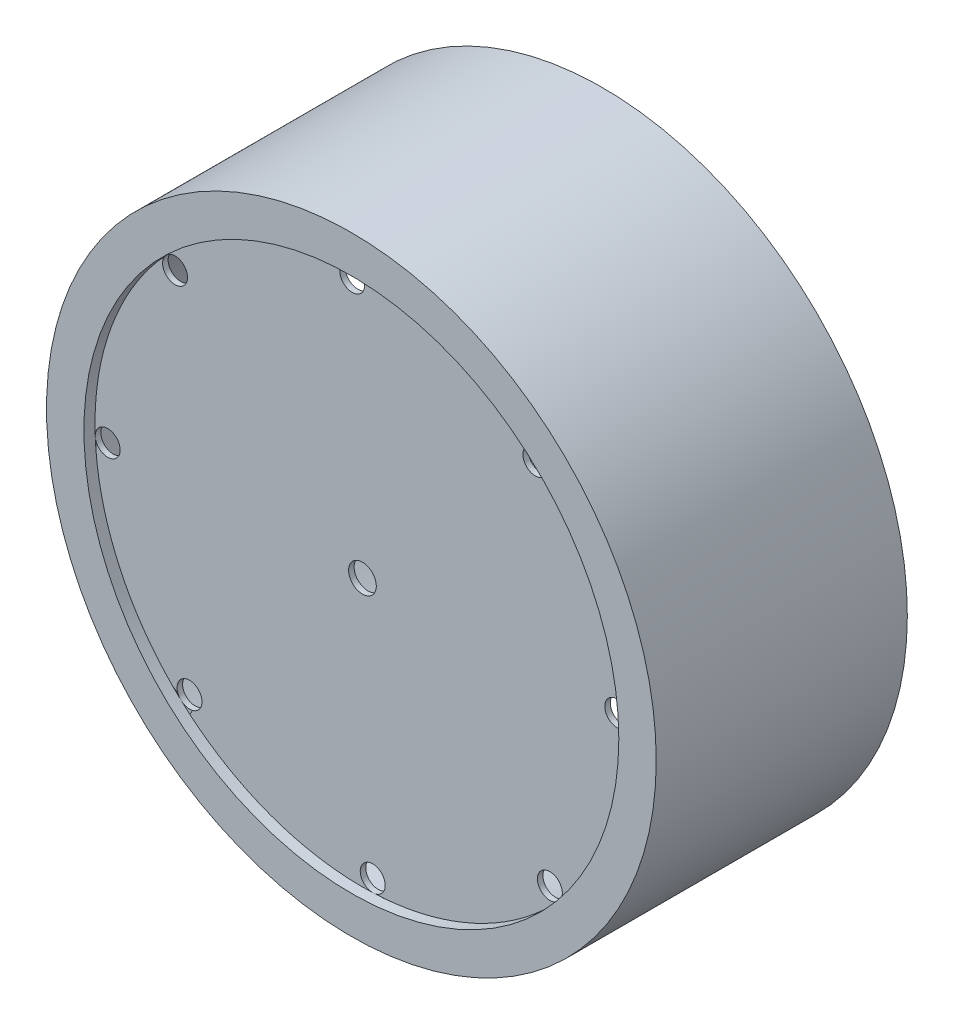
ISO-10303-21;
HEADER;
FILE_DESCRIPTION(('STEP AP214'),'2;1');
FILE_NAME('part.step','',(''),(''),'','','');
FILE_SCHEMA(('AUTOMOTIVE_DESIGN { 1 0 10303 214 1 1 1 1 }'));
ENDSEC;
DATA;
#1=APPLICATION_CONTEXT('core data for automotive mechanical design processes');
#2=APPLICATION_PROTOCOL_DEFINITION('international standard','automotive_design',2000,#1);
#3=PRODUCT_CONTEXT('',#1,'mechanical');
#4=PRODUCT('Part','Part','',(#3));
#5=PRODUCT_RELATED_PRODUCT_CATEGORY('part','',(#4));
#6=PRODUCT_DEFINITION_FORMATION('','',#4);
#7=PRODUCT_DEFINITION_CONTEXT('part definition',#1,'design');
#8=PRODUCT_DEFINITION('design','',#6,#7);
#9=PRODUCT_DEFINITION_SHAPE('','',#8);
#10=(LENGTH_UNIT() NAMED_UNIT(*) SI_UNIT(.MILLI.,.METRE.));
#11=(NAMED_UNIT(*) PLANE_ANGLE_UNIT() SI_UNIT($,.RADIAN.));
#12=(NAMED_UNIT(*) SI_UNIT($,.STERADIAN.) SOLID_ANGLE_UNIT());
#13=UNCERTAINTY_MEASURE_WITH_UNIT(LENGTH_MEASURE(1.E-05),#10,'distance_accuracy_value','');
#14=(GEOMETRIC_REPRESENTATION_CONTEXT(3) GLOBAL_UNCERTAINTY_ASSIGNED_CONTEXT((#13)) GLOBAL_UNIT_ASSIGNED_CONTEXT((#10,
#11,#12)) REPRESENTATION_CONTEXT('',''));
#15=CARTESIAN_POINT('',(0.,0.,0.));
#16=DIRECTION('',(0.,0.,1.));
#17=DIRECTION('',(1.,0.,0.));
#18=AXIS2_PLACEMENT_3D('',#15,#16,#17);
#19=CARTESIAN_POINT('',(0.,0.,45.3));
#20=DIRECTION('',(0.,0.,-1.));
#21=DIRECTION('',(-1.,0.,0.));
#22=AXIS2_PLACEMENT_3D('',#19,#20,#21);
#23=CYLINDRICAL_SURFACE('',#22,55.);
#24=CARTESIAN_POINT('',(0.,0.,0.));
#25=DIRECTION('',(0.,0.,1.));
#26=DIRECTION('',(1.,0.,0.));
#27=AXIS2_PLACEMENT_3D('',#24,#25,#26);
#28=CIRCLE('',#27,55.);
#29=CARTESIAN_POINT('',(-52.9150262213755,-14.9999999997046,0.));
#30=VERTEX_POINT('',#29);
#31=CARTESIAN_POINT('',(-51.2347538298004,-19.9999999999939,0.));
#32=VERTEX_POINT('',#31);
#33=EDGE_CURVE('E239',#30,#32,#28,.T.);
#34=ORIENTED_EDGE('',*,*,#33,.T.);
#35=DIRECTION('',(0.,0.,-1.));
#36=VECTOR('',#35,1.);
#37=CARTESIAN_POINT('',(-51.2347538298004,-19.9999999999939,45.3));
#38=LINE('',#37,#36);
#39=CARTESIAN_POINT('',(-51.2347538298004,-19.9999999999939,15.));
#40=VERTEX_POINT('',#39);
#41=EDGE_CURVE('E58',#32,#40,#38,.F.);
#42=ORIENTED_EDGE('',*,*,#41,.T.);
#43=CARTESIAN_POINT('',(0.,0.,15.));
#44=DIRECTION('',(0.,0.,1.));
#45=DIRECTION('',(1.,0.,0.));
#46=AXIS2_PLACEMENT_3D('',#43,#44,#45);
#47=CIRCLE('',#46,55.);
#48=CARTESIAN_POINT('',(-50.8333102578602,-20.9993944728919,15.));
#49=VERTEX_POINT('',#48);
#50=EDGE_CURVE('E11',#40,#49,#47,.T.);
#51=ORIENTED_EDGE('',*,*,#50,.T.);
#52=DIRECTION('',(0.,0.,-1.));
#53=VECTOR('',#52,1.);
#54=CARTESIAN_POINT('',(-50.8333102578602,-20.9993944728919,45.3));
#55=LINE('',#54,#53);
#56=CARTESIAN_POINT('',(-50.8333102578602,-20.9993944728919,0.));
#57=VERTEX_POINT('',#56);
#58=EDGE_CURVE('E132',#49,#57,#55,.T.);
#59=ORIENTED_EDGE('',*,*,#58,.T.);
#60=CARTESIAN_POINT('',(-53.1889357645864,-13.9977538280504,0.));
#61=VERTEX_POINT('',#60);
#62=EDGE_CURVE('E234',#57,#61,#28,.T.);
#63=ORIENTED_EDGE('',*,*,#62,.T.);
#64=DIRECTION('',(0.,0.,-1.));
#65=VECTOR('',#64,1.);
#66=CARTESIAN_POINT('',(-53.1889357645864,-13.9977538280504,15.));
#67=LINE('',#66,#65);
#68=CARTESIAN_POINT('',(-53.1889357645864,-13.9977538280504,15.));
#69=VERTEX_POINT('',#68);
#70=EDGE_CURVE('E189',#69,#61,#67,.T.);
#71=ORIENTED_EDGE('',*,*,#70,.F.);
#72=CARTESIAN_POINT('',(0.,0.,15.));
#73=DIRECTION('',(0.,0.,-1.));
#74=DIRECTION('',(-1.,0.,0.));
#75=AXIS2_PLACEMENT_3D('',#72,#73,#74);
#76=CIRCLE('',#75,55.);
#77=CARTESIAN_POINT('',(-52.9150262213755,-14.9999999997046,15.));
#78=VERTEX_POINT('',#77);
#79=EDGE_CURVE('E169',#78,#69,#76,.T.);
#80=ORIENTED_EDGE('',*,*,#79,.F.);
#81=DIRECTION('',(0.,0.,-1.));
#82=VECTOR('',#81,1.);
#83=CARTESIAN_POINT('',(-52.9150262213755,-14.9999999997046,15.));
#84=LINE('',#83,#82);
#85=EDGE_CURVE('E186',#78,#30,#84,.T.);
#86=ORIENTED_EDGE('',*,*,#85,.T.);
#87=EDGE_LOOP('',(#34,#42,#51,#59,#63,#71,#80,#86));
#88=FACE_BOUND('',#87,.T.);
#89=CARTESIAN_POINT('',(0.,0.,45.3));
#90=DIRECTION('',(0.,0.,1.));
#91=DIRECTION('',(1.,0.,0.));
#92=AXIS2_PLACEMENT_3D('',#89,#90,#91);
#93=CIRCLE('',#92,55.);
#94=CARTESIAN_POINT('',(55.,0.,45.3));
#95=VERTEX_POINT('',#94);
#96=EDGE_CURVE('E48',#95,#95,#93,.T.);
#97=ORIENTED_EDGE('',*,*,#96,.F.);
#98=EDGE_LOOP('',(#97));
#99=FACE_BOUND('',#98,.T.);
#100=ADVANCED_FACE('F41',(#88,#99),#23,.T.);
#101=CARTESIAN_POINT('',(0.,0.,45.3));
#102=DIRECTION('',(0.,0.,1.));
#103=DIRECTION('',(1.,0.,0.));
#104=AXIS2_PLACEMENT_3D('',#101,#102,#103);
#105=PLANE('',#104);
#106=CARTESIAN_POINT('',(0.,0.,45.3));
#107=DIRECTION('',(0.,0.,1.));
#108=DIRECTION('',(1.,0.,0.));
#109=AXIS2_PLACEMENT_3D('',#106,#107,#108);
#110=CIRCLE('',#109,48.25);
#111=CARTESIAN_POINT('',(48.25,0.,45.3));
#112=VERTEX_POINT('',#111);
#113=EDGE_CURVE('E227',#112,#112,#110,.T.);
#114=ORIENTED_EDGE('',*,*,#113,.F.);
#115=EDGE_LOOP('',(#114));
#116=FACE_BOUND('',#115,.T.);
#117=ORIENTED_EDGE('',*,*,#96,.T.);
#118=EDGE_LOOP('',(#117));
#119=FACE_BOUND('',#118,.T.);
#120=ADVANCED_FACE('F315',(#116,#119),#105,.T.);
#121=CARTESIAN_POINT('',(0.,0.,0.));
#122=DIRECTION('',(0.,0.,1.));
#123=DIRECTION('',(1.,0.,0.));
#124=AXIS2_PLACEMENT_3D('',#121,#122,#123);
#125=PLANE('',#124);
#126=ORIENTED_EDGE('',*,*,#62,.F.);
#127=DIRECTION('',(-1.,0.,0.));
#128=VECTOR('',#127,1.);
#129=CARTESIAN_POINT('',(-82.8329227528675,-20.9993944728919,0.));
#130=LINE('',#129,#128);
#131=CARTESIAN_POINT('',(-82.8329227528675,-20.9993944728919,0.));
#132=VERTEX_POINT('',#131);
#133=EDGE_CURVE('E151',#57,#132,#130,.T.);
#134=ORIENTED_EDGE('',*,*,#133,.T.);
#135=DIRECTION('',(0.,1.,0.));
#136=VECTOR('',#135,1.);
#137=CARTESIAN_POINT('',(-82.8329227528675,-19.9999999999939,0.));
#138=LINE('',#137,#136);
#139=CARTESIAN_POINT('',(-82.8329227528675,-19.9999999999939,0.));
#140=VERTEX_POINT('',#139);
#141=EDGE_CURVE('E142',#132,#140,#138,.T.);
#142=ORIENTED_EDGE('',*,*,#141,.T.);
#143=DIRECTION('',(1.,0.,0.));
#144=VECTOR('',#143,1.);
#145=CARTESIAN_POINT('',(-51.2347538298004,-19.9999999999939,0.));
#146=LINE('',#145,#144);
#147=EDGE_CURVE('E155',#140,#32,#146,.T.);
#148=ORIENTED_EDGE('',*,*,#147,.T.);
#149=ORIENTED_EDGE('',*,*,#33,.F.);
#150=DIRECTION('',(-1.,0.,0.));
#151=VECTOR('',#150,1.);
#152=CARTESIAN_POINT('',(0.,-14.9999999997046,0.));
#153=LINE('',#152,#151);
#154=CARTESIAN_POINT('',(-82.8329227528675,-14.9999999997046,0.));
#155=VERTEX_POINT('',#154);
#156=EDGE_CURVE('E166',#30,#155,#153,.T.);
#157=ORIENTED_EDGE('',*,*,#156,.T.);
#158=DIRECTION('',(0.,1.,0.));
#159=VECTOR('',#158,1.);
#160=CARTESIAN_POINT('',(-82.8329227528675,0.,0.));
#161=LINE('',#160,#159);
#162=CARTESIAN_POINT('',(-82.8329227528675,-13.9977538280504,0.));
#163=VERTEX_POINT('',#162);
#164=EDGE_CURVE('E161',#155,#163,#161,.T.);
#165=ORIENTED_EDGE('',*,*,#164,.T.);
#166=DIRECTION('',(1.,0.,0.));
#167=VECTOR('',#166,1.);
#168=CARTESIAN_POINT('',(0.,-13.9977538280504,0.));
#169=LINE('',#168,#167);
#170=EDGE_CURVE('E178',#163,#61,#169,.T.);
#171=ORIENTED_EDGE('',*,*,#170,.T.);
#172=EDGE_LOOP('',(#126,#134,#142,#148,#149,#157,#165,#171));
#173=FACE_BOUND('',#172,.T.);
#174=CARTESIAN_POINT('',(0.,0.,0.));
#175=DIRECTION('',(0.,0.,-1.));
#176=DIRECTION('',(-1.,0.,0.));
#177=AXIS2_PLACEMENT_3D('',#174,#175,#176);
#178=CIRCLE('',#177,50.);
#179=CARTESIAN_POINT('',(-50.,0.,0.));
#180=VERTEX_POINT('',#179);
#181=EDGE_CURVE('E224',#180,#180,#178,.T.);
#182=ORIENTED_EDGE('',*,*,#181,.F.);
#183=EDGE_LOOP('',(#182));
#184=FACE_BOUND('',#183,.T.);
#185=ADVANCED_FACE('F310',(#173,#184),#125,.F.);
#186=CARTESIAN_POINT('',(0.,0.,42.3));
#187=DIRECTION('',(0.,0.,-1.));
#188=DIRECTION('',(-1.,0.,0.));
#189=AXIS2_PLACEMENT_3D('',#186,#187,#188);
#190=CYLINDRICAL_SURFACE('',#189,50.);
#191=CARTESIAN_POINT('',(0.,0.,42.3));
#192=DIRECTION('',(0.,0.,-1.));
#193=DIRECTION('',(-1.,0.,0.));
#194=AXIS2_PLACEMENT_3D('',#191,#192,#193);
#195=CIRCLE('',#194,50.);
#196=CARTESIAN_POINT('',(-50.,0.,42.3));
#197=VERTEX_POINT('',#196);
#198=EDGE_CURVE('E231',#197,#197,#195,.T.);
#199=ORIENTED_EDGE('',*,*,#198,.F.);
#200=EDGE_LOOP('',(#199));
#201=FACE_BOUND('',#200,.T.);
#202=ORIENTED_EDGE('',*,*,#181,.T.);
#203=EDGE_LOOP('',(#202));
#204=FACE_BOUND('',#203,.T.);
#205=ADVANCED_FACE('F301',(#201,#204),#190,.F.);
#206=CARTESIAN_POINT('',(0.,0.,42.3));
#207=DIRECTION('',(0.,0.,-1.));
#208=DIRECTION('',(-1.,0.,0.));
#209=AXIS2_PLACEMENT_3D('',#206,#207,#208);
#210=PLANE('',#209);
#211=CARTESIAN_POINT('',(0.,0.,42.3));
#212=DIRECTION('',(0.,0.,-1.));
#213=DIRECTION('',(-1.,0.,0.));
#214=AXIS2_PLACEMENT_3D('',#211,#212,#213);
#215=CIRCLE('',#214,2.5);
#216=CARTESIAN_POINT('',(-2.5,0.,42.3));
#217=VERTEX_POINT('',#216);
#218=EDGE_CURVE('E185',#217,#217,#215,.T.);
#219=ORIENTED_EDGE('',*,*,#218,.F.);
#220=EDGE_LOOP('',(#219));
#221=FACE_BOUND('',#220,.T.);
#222=CARTESIAN_POINT('',(1.84762445308254,-45.9628794124168,42.3));
#223=DIRECTION('',(0.,0.,-1.));
#224=DIRECTION('',(-1.,0.,0.));
#225=AXIS2_PLACEMENT_3D('',#222,#223,#224);
#226=CIRCLE('',#225,2.25);
#227=CARTESIAN_POINT('',(-0.402375546917464,-45.9628794124168,42.3));
#228=VERTEX_POINT('',#227);
#229=EDGE_CURVE('E196',#228,#228,#226,.T.);
#230=ORIENTED_EDGE('',*,*,#229,.F.);
#231=EDGE_LOOP('',(#230));
#232=FACE_BOUND('',#231,.T.);
#233=CARTESIAN_POINT('',(-45.9628794124168,-1.84762445308301,42.3));
#234=DIRECTION('',(0.,0.,-1.));
#235=DIRECTION('',(-1.,0.,0.));
#236=AXIS2_PLACEMENT_3D('',#233,#234,#235);
#237=CIRCLE('',#236,2.25);
#238=CARTESIAN_POINT('',(-48.2128794124168,-1.84762445308301,42.3));
#239=VERTEX_POINT('',#238);
#240=EDGE_CURVE('E208',#239,#239,#237,.T.);
#241=ORIENTED_EDGE('',*,*,#240,.F.);
#242=EDGE_LOOP('',(#241));
#243=FACE_BOUND('',#242,.T.);
#244=CARTESIAN_POINT('',(-33.8071314952405,31.1941959355185,42.3));
#245=DIRECTION('',(0.,0.,-1.));
#246=DIRECTION('',(-1.,0.,0.));
#247=AXIS2_PLACEMENT_3D('',#244,#245,#246);
#248=CIRCLE('',#247,2.25);
#249=CARTESIAN_POINT('',(-36.0571314952405,31.1941959355185,42.3));
#250=VERTEX_POINT('',#249);
#251=EDGE_CURVE('E205',#250,#250,#248,.T.);
#252=ORIENTED_EDGE('',*,*,#251,.F.);
#253=EDGE_LOOP('',(#252));
#254=FACE_BOUND('',#253,.T.);
#255=CARTESIAN_POINT('',(-1.84762445308287,45.9628794124168,42.3));
#256=DIRECTION('',(0.,0.,-1.));
#257=DIRECTION('',(-1.,0.,0.));
#258=AXIS2_PLACEMENT_3D('',#255,#256,#257);
#259=CIRCLE('',#258,2.25);
#260=CARTESIAN_POINT('',(-4.09762445308287,45.9628794124168,42.3));
#261=VERTEX_POINT('',#260);
#262=EDGE_CURVE('E201',#261,#261,#259,.T.);
#263=ORIENTED_EDGE('',*,*,#262,.F.);
#264=EDGE_LOOP('',(#263));
#265=FACE_BOUND('',#264,.T.);
#266=CARTESIAN_POINT('',(33.8071314952403,-31.1941959355187,42.3));
#267=DIRECTION('',(0.,0.,-1.));
#268=DIRECTION('',(-1.,0.,0.));
#269=AXIS2_PLACEMENT_3D('',#266,#267,#268);
#270=CIRCLE('',#269,2.25);
#271=CARTESIAN_POINT('',(31.5571314952403,-31.1941959355187,42.3));
#272=VERTEX_POINT('',#271);
#273=EDGE_CURVE('E200',#272,#272,#270,.T.);
#274=ORIENTED_EDGE('',*,*,#273,.F.);
#275=EDGE_LOOP('',(#274));
#276=FACE_BOUND('',#275,.T.);
#277=CARTESIAN_POINT('',(45.9628794124168,1.8476244530827,42.3));
#278=DIRECTION('',(0.,0.,-1.));
#279=DIRECTION('',(-1.,0.,0.));
#280=AXIS2_PLACEMENT_3D('',#277,#278,#279);
#281=CIRCLE('',#280,2.25000000000001);
#282=CARTESIAN_POINT('',(43.7128794124168,1.8476244530827,42.3));
#283=VERTEX_POINT('',#282);
#284=EDGE_CURVE('E214',#283,#283,#281,.T.);
#285=ORIENTED_EDGE('',*,*,#284,.F.);
#286=EDGE_LOOP('',(#285));
#287=FACE_BOUND('',#286,.T.);
#288=CARTESIAN_POINT('',(31.1941959355186,33.8071314952404,42.3));
#289=DIRECTION('',(0.,0.,-1.));
#290=DIRECTION('',(-1.,0.,0.));
#291=AXIS2_PLACEMENT_3D('',#288,#289,#290);
#292=CIRCLE('',#291,2.25);
#293=CARTESIAN_POINT('',(28.9441959355186,33.8071314952404,42.3));
#294=VERTEX_POINT('',#293);
#295=EDGE_CURVE('E211',#294,#294,#292,.T.);
#296=ORIENTED_EDGE('',*,*,#295,.F.);
#297=EDGE_LOOP('',(#296));
#298=FACE_BOUND('',#297,.T.);
#299=CARTESIAN_POINT('',(-31.1941959355188,-33.8071314952402,42.3));
#300=DIRECTION('',(0.,0.,-1.));
#301=DIRECTION('',(-1.,0.,0.));
#302=AXIS2_PLACEMENT_3D('',#299,#300,#301);
#303=CIRCLE('',#302,2.25);
#304=CARTESIAN_POINT('',(-33.4441959355188,-33.8071314952402,42.3));
#305=VERTEX_POINT('',#304);
#306=EDGE_CURVE('E204',#305,#305,#303,.T.);
#307=ORIENTED_EDGE('',*,*,#306,.F.);
#308=EDGE_LOOP('',(#307));
#309=FACE_BOUND('',#308,.T.);
#310=ORIENTED_EDGE('',*,*,#198,.T.);
#311=EDGE_LOOP('',(#310));
#312=FACE_BOUND('',#311,.T.);
#313=ADVANCED_FACE('F298',(#221,#232,#243,#254,#265,#276,#287,#298,#309,#312),#210,.T.);
#314=CARTESIAN_POINT('',(0.,0.,43.3));
#315=DIRECTION('',(0.,0.,1.));
#316=DIRECTION('',(1.,0.,0.));
#317=AXIS2_PLACEMENT_3D('',#314,#315,#316);
#318=CYLINDRICAL_SURFACE('',#317,48.25);
#319=CARTESIAN_POINT('',(0.,0.,43.3));
#320=DIRECTION('',(0.,0.,1.));
#321=DIRECTION('',(1.,0.,0.));
#322=AXIS2_PLACEMENT_3D('',#319,#320,#321);
#323=CIRCLE('',#322,48.25);
#324=CARTESIAN_POINT('',(1.93799738828766,-48.2110637315024,43.3));
#325=VERTEX_POINT('',#324);
#326=CARTESIAN_POINT('',(35.4607411879423,-32.7199989975821,43.3));
#327=VERTEX_POINT('',#326);
#328=EDGE_CURVE('E277',#325,#327,#323,.T.);
#329=ORIENTED_EDGE('',*,*,#328,.F.);
#330=CARTESIAN_POINT('',(-32.7199989975822,-35.4607411879422,43.3));
#331=VERTEX_POINT('',#330);
#332=EDGE_CURVE('E270',#331,#325,#323,.T.);
#333=ORIENTED_EDGE('',*,*,#332,.F.);
#334=CARTESIAN_POINT('',(-48.2110637315024,-1.93799738828816,43.3));
#335=VERTEX_POINT('',#334);
#336=EDGE_CURVE('E276',#335,#331,#323,.T.);
#337=ORIENTED_EDGE('',*,*,#336,.F.);
#338=CARTESIAN_POINT('',(-35.4607411879425,32.7199989975819,43.3));
#339=VERTEX_POINT('',#338);
#340=EDGE_CURVE('E278',#339,#335,#323,.T.);
#341=ORIENTED_EDGE('',*,*,#340,.F.);
#342=CARTESIAN_POINT('',(-1.93799738828801,48.2110637315024,43.3));
#343=VERTEX_POINT('',#342);
#344=EDGE_CURVE('E602',#343,#339,#323,.T.);
#345=ORIENTED_EDGE('',*,*,#344,.F.);
#346=CARTESIAN_POINT('',(32.719998997582,35.4607411879424,43.3));
#347=VERTEX_POINT('',#346);
#348=EDGE_CURVE('E225',#347,#343,#323,.T.);
#349=ORIENTED_EDGE('',*,*,#348,.F.);
#350=CARTESIAN_POINT('',(48.2110637315024,1.93799738828784,43.3));
#351=VERTEX_POINT('',#350);
#352=EDGE_CURVE('E221',#351,#347,#323,.T.);
#353=ORIENTED_EDGE('',*,*,#352,.F.);
#354=EDGE_CURVE('E226',#327,#351,#323,.T.);
#355=ORIENTED_EDGE('',*,*,#354,.F.);
#356=EDGE_LOOP('',(#329,#333,#337,#341,#345,#349,#353,#355));
#357=FACE_BOUND('',#356,.T.);
#358=ORIENTED_EDGE('',*,*,#113,.T.);
#359=EDGE_LOOP('',(#358));
#360=FACE_BOUND('',#359,.T.);
#361=ADVANCED_FACE('F264',(#357,#360),#318,.F.);
#362=CARTESIAN_POINT('',(0.,0.,43.3));
#363=DIRECTION('',(0.,0.,1.));
#364=DIRECTION('',(1.,0.,0.));
#365=AXIS2_PLACEMENT_3D('',#362,#363,#364);
#366=PLANE('',#365);
#367=CARTESIAN_POINT('',(0.,0.,43.3));
#368=DIRECTION('',(0.,0.,1.));
#369=DIRECTION('',(1.,0.,0.));
#370=AXIS2_PLACEMENT_3D('',#367,#368,#369);
#371=CIRCLE('',#370,2.5);
#372=CARTESIAN_POINT('',(2.5,0.,43.3));
#373=VERTEX_POINT('',#372);
#374=EDGE_CURVE('E195',#373,#373,#371,.T.);
#375=ORIENTED_EDGE('',*,*,#374,.F.);
#376=EDGE_LOOP('',(#375));
#377=FACE_BOUND('',#376,.T.);
#378=ORIENTED_EDGE('',*,*,#332,.T.);
#379=CARTESIAN_POINT('',(1.84762445308254,-45.9628794124168,43.3));
#380=DIRECTION('',(0.,0.,1.));
#381=DIRECTION('',(1.,0.,0.));
#382=AXIS2_PLACEMENT_3D('',#379,#380,#381);
#383=CIRCLE('',#382,2.25);
#384=EDGE_CURVE('E230',#325,#325,#383,.T.);
#385=ORIENTED_EDGE('',*,*,#384,.F.);
#386=ORIENTED_EDGE('',*,*,#328,.T.);
#387=CARTESIAN_POINT('',(33.8071314952403,-31.1941959355187,43.3));
#388=DIRECTION('',(0.,0.,1.));
#389=DIRECTION('',(1.,0.,0.));
#390=AXIS2_PLACEMENT_3D('',#387,#388,#389);
#391=CIRCLE('',#390,2.25);
#392=EDGE_CURVE('E246',#327,#327,#391,.T.);
#393=ORIENTED_EDGE('',*,*,#392,.F.);
#394=ORIENTED_EDGE('',*,*,#354,.T.);
#395=CARTESIAN_POINT('',(45.9628794124168,1.8476244530827,43.3));
#396=DIRECTION('',(0.,0.,1.));
#397=DIRECTION('',(1.,0.,0.));
#398=AXIS2_PLACEMENT_3D('',#395,#396,#397);
#399=CIRCLE('',#398,2.25000000000001);
#400=EDGE_CURVE('E244',#351,#351,#399,.T.);
#401=ORIENTED_EDGE('',*,*,#400,.F.);
#402=ORIENTED_EDGE('',*,*,#352,.T.);
#403=CARTESIAN_POINT('',(31.1941959355186,33.8071314952404,43.3));
#404=DIRECTION('',(0.,0.,1.));
#405=DIRECTION('',(1.,0.,0.));
#406=AXIS2_PLACEMENT_3D('',#403,#404,#405);
#407=CIRCLE('',#406,2.25);
#408=EDGE_CURVE('E242',#347,#347,#407,.T.);
#409=ORIENTED_EDGE('',*,*,#408,.F.);
#410=ORIENTED_EDGE('',*,*,#348,.T.);
#411=CARTESIAN_POINT('',(-1.84762445308287,45.9628794124168,43.3));
#412=DIRECTION('',(0.,0.,1.));
#413=DIRECTION('',(1.,0.,0.));
#414=AXIS2_PLACEMENT_3D('',#411,#412,#413);
#415=CIRCLE('',#414,2.25);
#416=EDGE_CURVE('E248',#343,#343,#415,.T.);
#417=ORIENTED_EDGE('',*,*,#416,.F.);
#418=ORIENTED_EDGE('',*,*,#344,.T.);
#419=CARTESIAN_POINT('',(-33.8071314952405,31.1941959355185,43.3));
#420=DIRECTION('',(0.,0.,1.));
#421=DIRECTION('',(1.,0.,0.));
#422=AXIS2_PLACEMENT_3D('',#419,#420,#421);
#423=CIRCLE('',#422,2.25);
#424=EDGE_CURVE('E250',#339,#339,#423,.T.);
#425=ORIENTED_EDGE('',*,*,#424,.F.);
#426=ORIENTED_EDGE('',*,*,#340,.T.);
#427=CARTESIAN_POINT('',(-45.9628794124168,-1.84762445308301,43.3));
#428=DIRECTION('',(0.,0.,1.));
#429=DIRECTION('',(1.,0.,0.));
#430=AXIS2_PLACEMENT_3D('',#427,#428,#429);
#431=CIRCLE('',#430,2.25);
#432=EDGE_CURVE('E252',#335,#335,#431,.T.);
#433=ORIENTED_EDGE('',*,*,#432,.F.);
#434=ORIENTED_EDGE('',*,*,#336,.T.);
#435=CARTESIAN_POINT('',(-31.1941959355188,-33.8071314952402,43.3));
#436=DIRECTION('',(0.,0.,1.));
#437=DIRECTION('',(1.,0.,0.));
#438=AXIS2_PLACEMENT_3D('',#435,#436,#437);
#439=CIRCLE('',#438,2.25);
#440=EDGE_CURVE('E199',#331,#331,#439,.T.);
#441=ORIENTED_EDGE('',*,*,#440,.F.);
#442=EDGE_LOOP('',(#378,#385,#386,#393,#394,#401,#402,#409,#410,#417,#418,#425,#426,#433,#434,#441));
#443=FACE_BOUND('',#442,.T.);
#444=ADVANCED_FACE('F260',(#377,#443),#366,.T.);
#445=CARTESIAN_POINT('',(-31.1941959355188,-33.8071314952402,44.3));
#446=DIRECTION('',(0.,0.,-1.));
#447=DIRECTION('',(-1.,0.,0.));
#448=AXIS2_PLACEMENT_3D('',#445,#446,#447);
#449=CYLINDRICAL_SURFACE('',#448,2.25);
#450=ORIENTED_EDGE('',*,*,#440,.T.);
#451=EDGE_LOOP('',(#450));
#452=FACE_BOUND('',#451,.T.);
#453=ORIENTED_EDGE('',*,*,#306,.T.);
#454=EDGE_LOOP('',(#453));
#455=FACE_BOUND('',#454,.T.);
#456=ADVANCED_FACE('F263',(#452,#455),#449,.F.);
#457=CARTESIAN_POINT('',(31.1941959355186,33.8071314952404,44.3));
#458=DIRECTION('',(0.,0.,-1.));
#459=DIRECTION('',(-1.,0.,0.));
#460=AXIS2_PLACEMENT_3D('',#457,#458,#459);
#461=CYLINDRICAL_SURFACE('',#460,2.25);
#462=ORIENTED_EDGE('',*,*,#408,.T.);
#463=EDGE_LOOP('',(#462));
#464=FACE_BOUND('',#463,.T.);
#465=ORIENTED_EDGE('',*,*,#295,.T.);
#466=EDGE_LOOP('',(#465));
#467=FACE_BOUND('',#466,.T.);
#468=ADVANCED_FACE('F291',(#464,#467),#461,.F.);
#469=CARTESIAN_POINT('',(45.9628794124168,1.8476244530827,44.3));
#470=DIRECTION('',(0.,0.,-1.));
#471=DIRECTION('',(-1.,0.,0.));
#472=AXIS2_PLACEMENT_3D('',#469,#470,#471);
#473=CYLINDRICAL_SURFACE('',#472,2.25000000000001);
#474=ORIENTED_EDGE('',*,*,#400,.T.);
#475=EDGE_LOOP('',(#474));
#476=FACE_BOUND('',#475,.T.);
#477=ORIENTED_EDGE('',*,*,#284,.T.);
#478=EDGE_LOOP('',(#477));
#479=FACE_BOUND('',#478,.T.);
#480=ADVANCED_FACE('F294',(#476,#479),#473,.F.);
#481=CARTESIAN_POINT('',(33.8071314952403,-31.1941959355187,44.3));
#482=DIRECTION('',(0.,0.,-1.));
#483=DIRECTION('',(-1.,0.,0.));
#484=AXIS2_PLACEMENT_3D('',#481,#482,#483);
#485=CYLINDRICAL_SURFACE('',#484,2.25);
#486=ORIENTED_EDGE('',*,*,#392,.T.);
#487=EDGE_LOOP('',(#486));
#488=FACE_BOUND('',#487,.T.);
#489=ORIENTED_EDGE('',*,*,#273,.T.);
#490=EDGE_LOOP('',(#489));
#491=FACE_BOUND('',#490,.T.);
#492=ADVANCED_FACE('F374',(#488,#491),#485,.F.);
#493=CARTESIAN_POINT('',(-1.84762445308287,45.9628794124168,44.3));
#494=DIRECTION('',(0.,0.,-1.));
#495=DIRECTION('',(-1.,0.,0.));
#496=AXIS2_PLACEMENT_3D('',#493,#494,#495);
#497=CYLINDRICAL_SURFACE('',#496,2.25);
#498=ORIENTED_EDGE('',*,*,#416,.T.);
#499=EDGE_LOOP('',(#498));
#500=FACE_BOUND('',#499,.T.);
#501=ORIENTED_EDGE('',*,*,#262,.T.);
#502=EDGE_LOOP('',(#501));
#503=FACE_BOUND('',#502,.T.);
#504=ADVANCED_FACE('F370',(#500,#503),#497,.F.);
#505=CARTESIAN_POINT('',(-33.8071314952405,31.1941959355185,44.3));
#506=DIRECTION('',(0.,0.,-1.));
#507=DIRECTION('',(-1.,0.,0.));
#508=AXIS2_PLACEMENT_3D('',#505,#506,#507);
#509=CYLINDRICAL_SURFACE('',#508,2.25);
#510=ORIENTED_EDGE('',*,*,#424,.T.);
#511=EDGE_LOOP('',(#510));
#512=FACE_BOUND('',#511,.T.);
#513=ORIENTED_EDGE('',*,*,#251,.T.);
#514=EDGE_LOOP('',(#513));
#515=FACE_BOUND('',#514,.T.);
#516=ADVANCED_FACE('F373',(#512,#515),#509,.F.);
#517=CARTESIAN_POINT('',(-45.9628794124168,-1.84762445308301,44.3));
#518=DIRECTION('',(0.,0.,-1.));
#519=DIRECTION('',(-1.,0.,0.));
#520=AXIS2_PLACEMENT_3D('',#517,#518,#519);
#521=CYLINDRICAL_SURFACE('',#520,2.25);
#522=ORIENTED_EDGE('',*,*,#432,.T.);
#523=EDGE_LOOP('',(#522));
#524=FACE_BOUND('',#523,.T.);
#525=ORIENTED_EDGE('',*,*,#240,.T.);
#526=EDGE_LOOP('',(#525));
#527=FACE_BOUND('',#526,.T.);
#528=ADVANCED_FACE('F368',(#524,#527),#521,.F.);
#529=CARTESIAN_POINT('',(1.84762445308254,-45.9628794124168,44.3));
#530=DIRECTION('',(0.,0.,-1.));
#531=DIRECTION('',(-1.,0.,0.));
#532=AXIS2_PLACEMENT_3D('',#529,#530,#531);
#533=CYLINDRICAL_SURFACE('',#532,2.25);
#534=ORIENTED_EDGE('',*,*,#384,.T.);
#535=EDGE_LOOP('',(#534));
#536=FACE_BOUND('',#535,.T.);
#537=ORIENTED_EDGE('',*,*,#229,.T.);
#538=EDGE_LOOP('',(#537));
#539=FACE_BOUND('',#538,.T.);
#540=ADVANCED_FACE('F365',(#536,#539),#533,.F.);
#541=CARTESIAN_POINT('',(0.,0.,47.3));
#542=DIRECTION('',(0.,0.,-1.));
#543=DIRECTION('',(-1.,0.,0.));
#544=AXIS2_PLACEMENT_3D('',#541,#542,#543);
#545=CYLINDRICAL_SURFACE('',#544,2.5);
#546=ORIENTED_EDGE('',*,*,#374,.T.);
#547=EDGE_LOOP('',(#546));
#548=FACE_BOUND('',#547,.T.);
#549=ORIENTED_EDGE('',*,*,#218,.T.);
#550=EDGE_LOOP('',(#549));
#551=FACE_BOUND('',#550,.T.);
#552=ADVANCED_FACE('F257',(#548,#551),#545,.F.);
#553=CARTESIAN_POINT('',(-82.8329227528675,0.,15.));
#554=DIRECTION('',(-1.,0.,0.));
#555=DIRECTION('',(0.,0.,1.));
#556=AXIS2_PLACEMENT_3D('',#553,#554,#555);
#557=PLANE('',#556);
#558=ORIENTED_EDGE('',*,*,#164,.F.);
#559=DIRECTION('',(0.,0.,-1.));
#560=VECTOR('',#559,1.);
#561=CARTESIAN_POINT('',(-82.8329227528675,-14.9999999997046,15.));
#562=LINE('',#561,#560);
#563=CARTESIAN_POINT('',(-82.8329227528675,-14.9999999997046,15.));
#564=VERTEX_POINT('',#563);
#565=EDGE_CURVE('E183',#564,#155,#562,.T.);
#566=ORIENTED_EDGE('',*,*,#565,.F.);
#567=DIRECTION('',(0.,1.,0.));
#568=VECTOR('',#567,1.);
#569=CARTESIAN_POINT('',(-82.8329227528675,0.,15.));
#570=LINE('',#569,#568);
#571=CARTESIAN_POINT('',(-82.8329227528675,-13.9977538280504,15.));
#572=VERTEX_POINT('',#571);
#573=EDGE_CURVE('E162',#564,#572,#570,.T.);
#574=ORIENTED_EDGE('',*,*,#573,.T.);
#575=DIRECTION('',(0.,0.,-1.));
#576=VECTOR('',#575,1.);
#577=CARTESIAN_POINT('',(-82.8329227528675,-13.9977538280504,15.));
#578=LINE('',#577,#576);
#579=EDGE_CURVE('E175',#572,#163,#578,.T.);
#580=ORIENTED_EDGE('',*,*,#579,.T.);
#581=EDGE_LOOP('',(#558,#566,#574,#580));
#582=FACE_BOUND('',#581,.T.);
#583=ADVANCED_FACE('F345',(#582),#557,.T.);
#584=CARTESIAN_POINT('',(0.,-14.9999999997046,15.));
#585=DIRECTION('',(0.,-1.,0.));
#586=DIRECTION('',(1.,0.,0.));
#587=AXIS2_PLACEMENT_3D('',#584,#585,#586);
#588=PLANE('',#587);
#589=CARTESIAN_POINT('',(-75.3329227528675,-14.9999999997046,7.5));
#590=DIRECTION('',(0.,-1.,0.));
#591=DIRECTION('',(1.,0.,0.));
#592=AXIS2_PLACEMENT_3D('',#589,#590,#591);
#593=CIRCLE('',#592,2.5);
#594=CARTESIAN_POINT('',(-72.8329227528675,-14.9999999997046,7.5));
#595=VERTEX_POINT('',#594);
#596=EDGE_CURVE('E153',#595,#595,#593,.T.);
#597=ORIENTED_EDGE('',*,*,#596,.F.);
#598=EDGE_LOOP('',(#597));
#599=FACE_BOUND('',#598,.T.);
#600=ORIENTED_EDGE('',*,*,#156,.F.);
#601=ORIENTED_EDGE('',*,*,#85,.F.);
#602=DIRECTION('',(-1.,0.,0.));
#603=VECTOR('',#602,1.);
#604=CARTESIAN_POINT('',(0.,-14.9999999997046,15.));
#605=LINE('',#604,#603);
#606=EDGE_CURVE('E172',#78,#564,#605,.T.);
#607=ORIENTED_EDGE('',*,*,#606,.T.);
#608=ORIENTED_EDGE('',*,*,#565,.T.);
#609=EDGE_LOOP('',(#600,#601,#607,#608));
#610=FACE_BOUND('',#609,.T.);
#611=ADVANCED_FACE('F347',(#599,#610),#588,.T.);
#612=CARTESIAN_POINT('',(0.,-13.9977538280504,15.));
#613=DIRECTION('',(0.,1.,0.));
#614=DIRECTION('',(-1.,0.,0.));
#615=AXIS2_PLACEMENT_3D('',#612,#613,#614);
#616=PLANE('',#615);
#617=CARTESIAN_POINT('',(-75.3329227528675,-13.9977538280504,7.5));
#618=DIRECTION('',(0.,1.,0.));
#619=DIRECTION('',(-1.,0.,0.));
#620=AXIS2_PLACEMENT_3D('',#617,#618,#619);
#621=CIRCLE('',#620,2.5);
#622=CARTESIAN_POINT('',(-77.8329227528675,-13.9977538280504,7.5));
#623=VERTEX_POINT('',#622);
#624=EDGE_CURVE('E533',#623,#623,#621,.T.);
#625=ORIENTED_EDGE('',*,*,#624,.F.);
#626=EDGE_LOOP('',(#625));
#627=FACE_BOUND('',#626,.T.);
#628=ORIENTED_EDGE('',*,*,#170,.F.);
#629=ORIENTED_EDGE('',*,*,#579,.F.);
#630=DIRECTION('',(1.,0.,0.));
#631=VECTOR('',#630,1.);
#632=CARTESIAN_POINT('',(0.,-13.9977538280504,15.));
#633=LINE('',#632,#631);
#634=EDGE_CURVE('E165',#572,#69,#633,.T.);
#635=ORIENTED_EDGE('',*,*,#634,.T.);
#636=ORIENTED_EDGE('',*,*,#70,.T.);
#637=EDGE_LOOP('',(#628,#629,#635,#636));
#638=FACE_BOUND('',#637,.T.);
#639=ADVANCED_FACE('F337',(#627,#638),#616,.T.);
#640=CARTESIAN_POINT('',(0.,0.,15.));
#641=DIRECTION('',(0.,0.,-1.));
#642=DIRECTION('',(-1.,0.,0.));
#643=AXIS2_PLACEMENT_3D('',#640,#641,#642);
#644=PLANE('',#643);
#645=ORIENTED_EDGE('',*,*,#573,.F.);
#646=ORIENTED_EDGE('',*,*,#606,.F.);
#647=ORIENTED_EDGE('',*,*,#79,.T.);
#648=ORIENTED_EDGE('',*,*,#634,.F.);
#649=EDGE_LOOP('',(#645,#646,#647,#648));
#650=FACE_BOUND('',#649,.T.);
#651=ADVANCED_FACE('F341',(#650),#644,.F.);
#652=CARTESIAN_POINT('',(-51.2347538298004,-19.9999999999939,15.));
#653=DIRECTION('',(0.,1.,0.));
#654=DIRECTION('',(-1.,0.,0.));
#655=AXIS2_PLACEMENT_3D('',#652,#653,#654);
#656=PLANE('',#655);
#657=CARTESIAN_POINT('',(-75.3329227528675,-19.9999999999939,7.5));
#658=DIRECTION('',(0.,1.,0.));
#659=DIRECTION('',(-1.,0.,0.));
#660=AXIS2_PLACEMENT_3D('',#657,#658,#659);
#661=CIRCLE('',#660,2.5);
#662=CARTESIAN_POINT('',(-77.8329227528675,-19.9999999999939,7.5));
#663=VERTEX_POINT('',#662);
#664=EDGE_CURVE('E534',#663,#663,#661,.T.);
#665=ORIENTED_EDGE('',*,*,#664,.F.);
#666=EDGE_LOOP('',(#665));
#667=FACE_BOUND('',#666,.T.);
#668=ORIENTED_EDGE('',*,*,#41,.F.);
#669=ORIENTED_EDGE('',*,*,#147,.F.);
#670=DIRECTION('',(0.,0.,-1.));
#671=VECTOR('',#670,1.);
#672=CARTESIAN_POINT('',(-82.8329227528675,-19.9999999999939,15.));
#673=LINE('',#672,#671);
#674=CARTESIAN_POINT('',(-82.8329227528675,-19.9999999999939,15.));
#675=VERTEX_POINT('',#674);
#676=EDGE_CURVE('E143',#675,#140,#673,.T.);
#677=ORIENTED_EDGE('',*,*,#676,.F.);
#678=DIRECTION('',(1.,-5.42465204687555E-10,0.));
#679=VECTOR('',#678,1.);
#680=CARTESIAN_POINT('',(-51.2252753962744,-19.9999999999991,15.));
#681=LINE('',#680,#679);
#682=EDGE_CURVE('E136',#675,#40,#681,.T.);
#683=ORIENTED_EDGE('',*,*,#682,.T.);
#684=EDGE_LOOP('',(#668,#669,#677,#683));
#685=FACE_BOUND('',#684,.T.);
#686=ADVANCED_FACE('F334',(#667,#685),#656,.T.);
#687=CARTESIAN_POINT('',(-82.8329227528675,-20.9993944728919,15.));
#688=DIRECTION('',(0.,-1.,0.));
#689=DIRECTION('',(0.,0.,-1.));
#690=AXIS2_PLACEMENT_3D('',#687,#688,#689);
#691=PLANE('',#690);
#692=CARTESIAN_POINT('',(-75.3329227528675,-20.9993944728919,7.5));
#693=DIRECTION('',(0.,-1.,0.));
#694=DIRECTION('',(0.,0.,-1.));
#695=AXIS2_PLACEMENT_3D('',#692,#693,#694);
#696=CIRCLE('',#695,2.5);
#697=CARTESIAN_POINT('',(-75.3329227528675,-20.9993944728919,5.00000000000001));
#698=VERTEX_POINT('',#697);
#699=EDGE_CURVE('E538',#698,#698,#696,.T.);
#700=ORIENTED_EDGE('',*,*,#699,.F.);
#701=EDGE_LOOP('',(#700));
#702=FACE_BOUND('',#701,.T.);
#703=ORIENTED_EDGE('',*,*,#58,.F.);
#704=DIRECTION('',(-1.,0.,0.));
#705=VECTOR('',#704,1.);
#706=CARTESIAN_POINT('',(-82.8329227528675,-20.9993944728919,15.));
#707=LINE('',#706,#705);
#708=CARTESIAN_POINT('',(-82.8329227528675,-20.9993944728919,15.));
#709=VERTEX_POINT('',#708);
#710=EDGE_CURVE('E126',#49,#709,#707,.T.);
#711=ORIENTED_EDGE('',*,*,#710,.T.);
#712=DIRECTION('',(0.,0.,-1.));
#713=VECTOR('',#712,1.);
#714=CARTESIAN_POINT('',(-82.8329227528675,-20.9993944728919,15.));
#715=LINE('',#714,#713);
#716=EDGE_CURVE('E130',#709,#132,#715,.T.);
#717=ORIENTED_EDGE('',*,*,#716,.T.);
#718=ORIENTED_EDGE('',*,*,#133,.F.);
#719=EDGE_LOOP('',(#703,#711,#717,#718));
#720=FACE_BOUND('',#719,.T.);
#721=ADVANCED_FACE('F128',(#702,#720),#691,.T.);
#722=CARTESIAN_POINT('',(-82.8329227528675,-19.9999999999939,15.));
#723=DIRECTION('',(-1.,0.,0.));
#724=DIRECTION('',(0.,0.,1.));
#725=AXIS2_PLACEMENT_3D('',#722,#723,#724);
#726=PLANE('',#725);
#727=ORIENTED_EDGE('',*,*,#141,.F.);
#728=ORIENTED_EDGE('',*,*,#716,.F.);
#729=DIRECTION('',(0.,1.,0.));
#730=VECTOR('',#729,1.);
#731=CARTESIAN_POINT('',(-82.8329227528675,-19.9999999999939,15.));
#732=LINE('',#731,#730);
#733=EDGE_CURVE('E135',#709,#675,#732,.T.);
#734=ORIENTED_EDGE('',*,*,#733,.T.);
#735=ORIENTED_EDGE('',*,*,#676,.T.);
#736=EDGE_LOOP('',(#727,#728,#734,#735));
#737=FACE_BOUND('',#736,.T.);
#738=ADVANCED_FACE('F140',(#737),#726,.T.);
#739=CARTESIAN_POINT('',(0.,0.,15.));
#740=DIRECTION('',(0.,0.,1.));
#741=DIRECTION('',(1.,0.,0.));
#742=AXIS2_PLACEMENT_3D('',#739,#740,#741);
#743=PLANE('',#742);
#744=ORIENTED_EDGE('',*,*,#50,.F.);
#745=ORIENTED_EDGE('',*,*,#682,.F.);
#746=ORIENTED_EDGE('',*,*,#733,.F.);
#747=ORIENTED_EDGE('',*,*,#710,.F.);
#748=EDGE_LOOP('',(#744,#745,#746,#747));
#749=FACE_BOUND('',#748,.T.);
#750=ADVANCED_FACE('F145',(#749),#743,.T.);
#751=CARTESIAN_POINT('',(-75.3329227528675,-12.9993944728919,7.5));
#752=DIRECTION('',(0.,-1.,0.));
#753=DIRECTION('',(0.,0.,-1.));
#754=AXIS2_PLACEMENT_3D('',#751,#752,#753);
#755=CYLINDRICAL_SURFACE('',#754,2.5);
#756=ORIENTED_EDGE('',*,*,#664,.T.);
#757=EDGE_LOOP('',(#756));
#758=FACE_BOUND('',#757,.T.);
#759=ORIENTED_EDGE('',*,*,#699,.T.);
#760=EDGE_LOOP('',(#759));
#761=FACE_BOUND('',#760,.T.);
#762=ADVANCED_FACE('F509',(#758,#761),#755,.F.);
#763=ORIENTED_EDGE('',*,*,#596,.T.);
#764=EDGE_LOOP('',(#763));
#765=FACE_BOUND('',#764,.T.);
#766=ORIENTED_EDGE('',*,*,#624,.T.);
#767=EDGE_LOOP('',(#766));
#768=FACE_BOUND('',#767,.T.);
#769=ADVANCED_FACE('F517',(#765,#768),#755,.F.);
#770=CLOSED_SHELL('',(#100,#120,#185,#205,#313,#361,#444,#456,#468,#480,#492,#504,#516,#528,
#540,#552,#583,#611,#639,#651,#686,#721,#738,#750,#762,#769));
#771=MANIFOLD_SOLID_BREP('B2',#770);
#772=ADVANCED_BREP_SHAPE_REPRESENTATION('',(#18,#771),#14);
#773=SHAPE_DEFINITION_REPRESENTATION(#9,#772);
ENDSEC;
END-ISO-10303-21;
